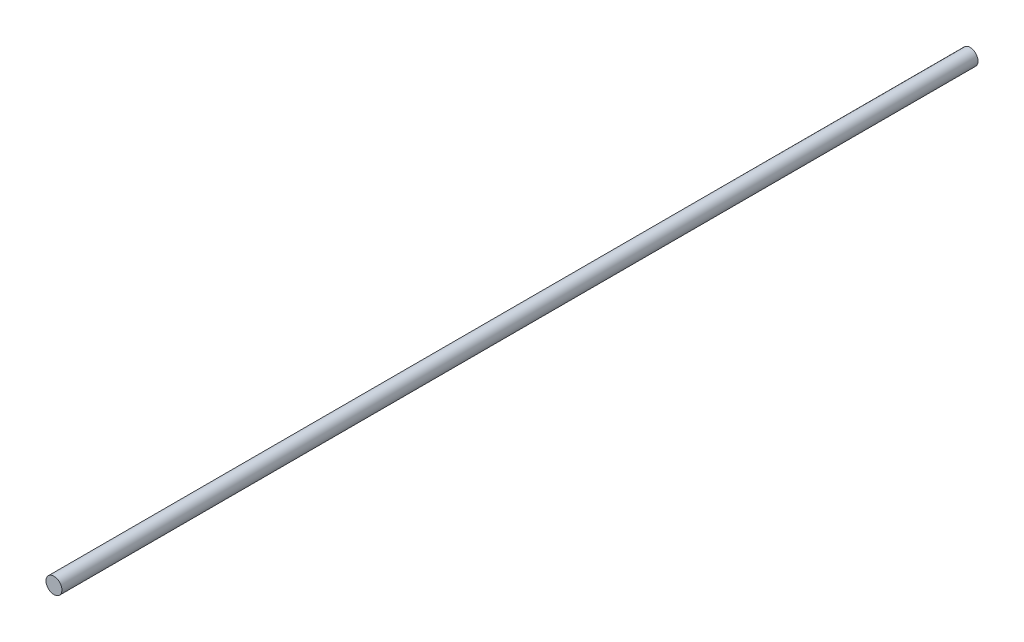
ISO-10303-21;
HEADER;
FILE_DESCRIPTION(('STEP AP214'),'2;1');
FILE_NAME('part.step','',(''),(''),'','','');
FILE_SCHEMA(('AUTOMOTIVE_DESIGN { 1 0 10303 214 1 1 1 1 }'));
ENDSEC;
DATA;
#1=APPLICATION_CONTEXT('core data for automotive mechanical design processes');
#2=APPLICATION_PROTOCOL_DEFINITION('international standard','automotive_design',2000,#1);
#3=PRODUCT_CONTEXT('',#1,'mechanical');
#4=PRODUCT('Part','Part','',(#3));
#5=PRODUCT_RELATED_PRODUCT_CATEGORY('part','',(#4));
#6=PRODUCT_DEFINITION_FORMATION('','',#4);
#7=PRODUCT_DEFINITION_CONTEXT('part definition',#1,'design');
#8=PRODUCT_DEFINITION('design','',#6,#7);
#9=PRODUCT_DEFINITION_SHAPE('','',#8);
#10=(LENGTH_UNIT() NAMED_UNIT(*) SI_UNIT(.MILLI.,.METRE.));
#11=(NAMED_UNIT(*) PLANE_ANGLE_UNIT() SI_UNIT($,.RADIAN.));
#12=(NAMED_UNIT(*) SI_UNIT($,.STERADIAN.) SOLID_ANGLE_UNIT());
#13=UNCERTAINTY_MEASURE_WITH_UNIT(LENGTH_MEASURE(1.E-05),#10,'distance_accuracy_value','');
#14=(GEOMETRIC_REPRESENTATION_CONTEXT(3) GLOBAL_UNCERTAINTY_ASSIGNED_CONTEXT((#13)) GLOBAL_UNIT_ASSIGNED_CONTEXT((#10,
#11,#12)) REPRESENTATION_CONTEXT('',''));
#15=CARTESIAN_POINT('',(0.,0.,0.));
#16=DIRECTION('',(0.,0.,1.));
#17=DIRECTION('',(1.,0.,0.));
#18=AXIS2_PLACEMENT_3D('',#15,#16,#17);
#19=CARTESIAN_POINT('',(0.,0.,460.));
#20=DIRECTION('',(0.,0.,-1.));
#21=DIRECTION('',(-1.,0.,0.));
#22=AXIS2_PLACEMENT_3D('',#19,#20,#21);
#23=CYLINDRICAL_SURFACE('',#22,4.);
#24=CARTESIAN_POINT('',(0.,0.,460.));
#25=DIRECTION('',(0.,0.,1.));
#26=DIRECTION('',(1.,0.,0.));
#27=AXIS2_PLACEMENT_3D('',#24,#25,#26);
#28=CIRCLE('',#27,4.);
#29=CARTESIAN_POINT('',(4.,0.,460.));
#30=VERTEX_POINT('',#29);
#31=EDGE_CURVE('E10',#30,#30,#28,.T.);
#32=ORIENTED_EDGE('',*,*,#31,.F.);
#33=EDGE_LOOP('',(#32));
#34=FACE_BOUND('',#33,.T.);
#35=CARTESIAN_POINT('',(0.,0.,0.));
#36=DIRECTION('',(0.,0.,1.));
#37=DIRECTION('',(1.,0.,0.));
#38=AXIS2_PLACEMENT_3D('',#35,#36,#37);
#39=CIRCLE('',#38,4.);
#40=CARTESIAN_POINT('',(4.,0.,0.));
#41=VERTEX_POINT('',#40);
#42=EDGE_CURVE('E40',#41,#41,#39,.T.);
#43=ORIENTED_EDGE('',*,*,#42,.T.);
#44=EDGE_LOOP('',(#43));
#45=FACE_BOUND('',#44,.T.);
#46=ADVANCED_FACE('F37',(#34,#45),#23,.T.);
#47=CARTESIAN_POINT('',(0.,0.,460.));
#48=DIRECTION('',(0.,0.,1.));
#49=DIRECTION('',(1.,0.,0.));
#50=AXIS2_PLACEMENT_3D('',#47,#48,#49);
#51=PLANE('',#50);
#52=ORIENTED_EDGE('',*,*,#31,.T.);
#53=EDGE_LOOP('',(#52));
#54=FACE_BOUND('',#53,.T.);
#55=ADVANCED_FACE('F52',(#54),#51,.T.);
#56=CARTESIAN_POINT('',(0.,0.,0.));
#57=DIRECTION('',(0.,0.,1.));
#58=DIRECTION('',(1.,0.,0.));
#59=AXIS2_PLACEMENT_3D('',#56,#57,#58);
#60=PLANE('',#59);
#61=ORIENTED_EDGE('',*,*,#42,.F.);
#62=EDGE_LOOP('',(#61));
#63=FACE_BOUND('',#62,.T.);
#64=ADVANCED_FACE('F50',(#63),#60,.F.);
#65=CLOSED_SHELL('',(#46,#55,#64));
#66=MANIFOLD_SOLID_BREP('B2',#65);
#67=ADVANCED_BREP_SHAPE_REPRESENTATION('',(#18,#66),#14);
#68=SHAPE_DEFINITION_REPRESENTATION(#9,#67);
ENDSEC;
END-ISO-10303-21;
